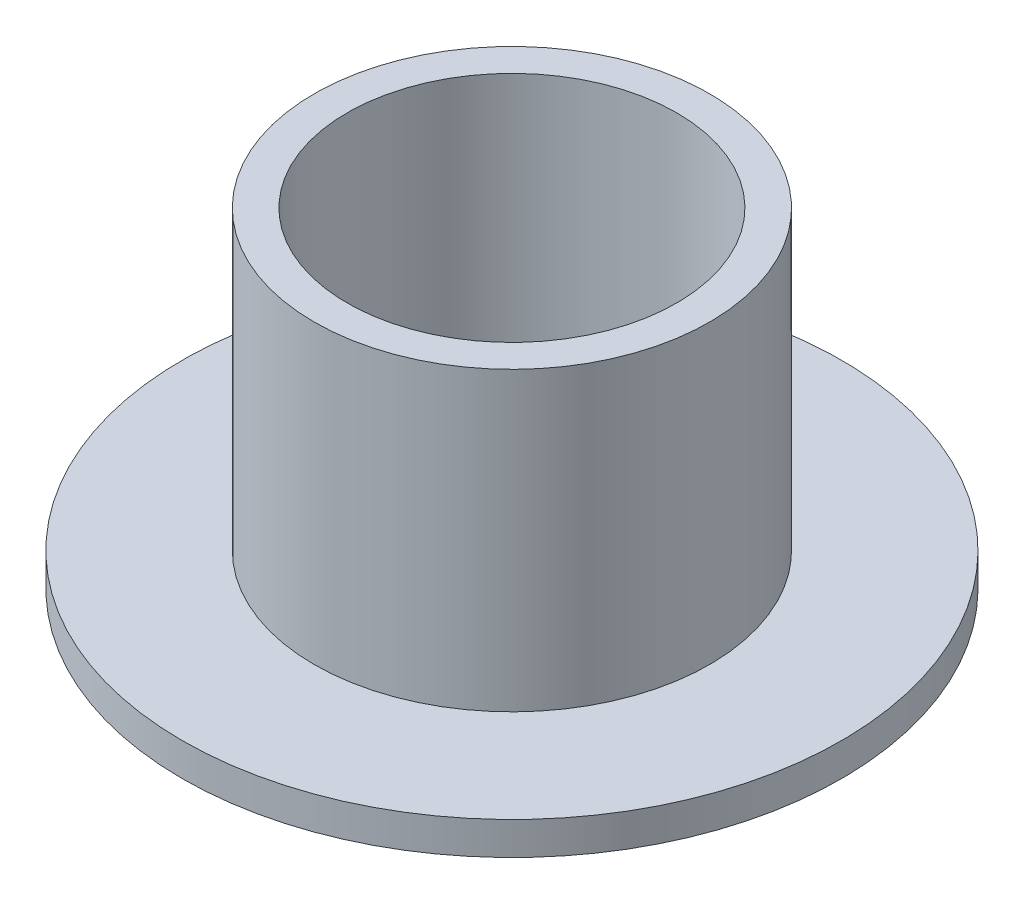
ISO-10303-21;
HEADER;
FILE_DESCRIPTION(('STEP AP214'),'2;1');
FILE_NAME('part.step','',(''),(''),'','','');
FILE_SCHEMA(('AUTOMOTIVE_DESIGN { 1 0 10303 214 1 1 1 1 }'));
ENDSEC;
DATA;
#1=APPLICATION_CONTEXT('core data for automotive mechanical design processes');
#2=APPLICATION_PROTOCOL_DEFINITION('international standard','automotive_design',2000,#1);
#3=PRODUCT_CONTEXT('',#1,'mechanical');
#4=PRODUCT('Part','Part','',(#3));
#5=PRODUCT_RELATED_PRODUCT_CATEGORY('part','',(#4));
#6=PRODUCT_DEFINITION_FORMATION('','',#4);
#7=PRODUCT_DEFINITION_CONTEXT('part definition',#1,'design');
#8=PRODUCT_DEFINITION('design','',#6,#7);
#9=PRODUCT_DEFINITION_SHAPE('','',#8);
#10=(LENGTH_UNIT() NAMED_UNIT(*) SI_UNIT(.MILLI.,.METRE.));
#11=(NAMED_UNIT(*) PLANE_ANGLE_UNIT() SI_UNIT($,.RADIAN.));
#12=(NAMED_UNIT(*) SI_UNIT($,.STERADIAN.) SOLID_ANGLE_UNIT());
#13=UNCERTAINTY_MEASURE_WITH_UNIT(LENGTH_MEASURE(1.E-05),#10,'distance_accuracy_value','');
#14=(GEOMETRIC_REPRESENTATION_CONTEXT(3) GLOBAL_UNCERTAINTY_ASSIGNED_CONTEXT((#13)) GLOBAL_UNIT_ASSIGNED_CONTEXT((#10,
#11,#12)) REPRESENTATION_CONTEXT('',''));
#15=CARTESIAN_POINT('',(0.,0.,0.));
#16=DIRECTION('',(0.,0.,1.));
#17=DIRECTION('',(1.,0.,0.));
#18=AXIS2_PLACEMENT_3D('',#15,#16,#17);
#19=CARTESIAN_POINT('',(0.,0.5,0.));
#20=DIRECTION('',(0.,-1.,0.));
#21=DIRECTION('',(0.,0.,-1.));
#22=AXIS2_PLACEMENT_3D('',#19,#20,#21);
#23=CYLINDRICAL_SURFACE('',#22,5.);
#24=CARTESIAN_POINT('',(0.,0.5,0.));
#25=DIRECTION('',(0.,1.,0.));
#26=DIRECTION('',(0.,0.,1.));
#27=AXIS2_PLACEMENT_3D('',#24,#25,#26);
#28=CIRCLE('',#27,5.);
#29=CARTESIAN_POINT('',(0.,0.5,5.));
#30=VERTEX_POINT('',#29);
#31=EDGE_CURVE('E49',#30,#30,#28,.T.);
#32=ORIENTED_EDGE('',*,*,#31,.F.);
#33=EDGE_LOOP('',(#32));
#34=FACE_BOUND('',#33,.T.);
#35=CARTESIAN_POINT('',(0.,0.,0.));
#36=DIRECTION('',(0.,1.,0.));
#37=DIRECTION('',(0.,0.,1.));
#38=AXIS2_PLACEMENT_3D('',#35,#36,#37);
#39=CIRCLE('',#38,5.);
#40=CARTESIAN_POINT('',(0.,0.,5.));
#41=VERTEX_POINT('',#40);
#42=EDGE_CURVE('E44',#41,#41,#39,.T.);
#43=ORIENTED_EDGE('',*,*,#42,.T.);
#44=EDGE_LOOP('',(#43));
#45=FACE_BOUND('',#44,.T.);
#46=ADVANCED_FACE('F41',(#34,#45),#23,.T.);
#47=CARTESIAN_POINT('',(0.,0.5,0.));
#48=DIRECTION('',(0.,1.,0.));
#49=DIRECTION('',(0.,0.,1.));
#50=AXIS2_PLACEMENT_3D('',#47,#48,#49);
#51=PLANE('',#50);
#52=CARTESIAN_POINT('',(0.,0.5,0.));
#53=DIRECTION('',(0.,1.,0.));
#54=DIRECTION('',(0.,0.,1.));
#55=AXIS2_PLACEMENT_3D('',#52,#53,#54);
#56=CIRCLE('',#55,3.);
#57=CARTESIAN_POINT('',(0.,0.5,3.));
#58=VERTEX_POINT('',#57);
#59=EDGE_CURVE('E10',#58,#58,#56,.T.);
#60=ORIENTED_EDGE('',*,*,#59,.F.);
#61=EDGE_LOOP('',(#60));
#62=FACE_BOUND('',#61,.T.);
#63=ORIENTED_EDGE('',*,*,#31,.T.);
#64=EDGE_LOOP('',(#63));
#65=FACE_BOUND('',#64,.T.);
#66=ADVANCED_FACE('F82',(#62,#65),#51,.T.);
#67=CARTESIAN_POINT('',(0.,0.,0.));
#68=DIRECTION('',(0.,1.,0.));
#69=DIRECTION('',(0.,0.,1.));
#70=AXIS2_PLACEMENT_3D('',#67,#68,#69);
#71=PLANE('',#70);
#72=CARTESIAN_POINT('',(0.,0.,0.));
#73=DIRECTION('',(0.,-1.,0.));
#74=DIRECTION('',(0.,0.,-1.));
#75=AXIS2_PLACEMENT_3D('',#72,#73,#74);
#76=CIRCLE('',#75,2.5);
#77=CARTESIAN_POINT('',(0.,0.,-2.5));
#78=VERTEX_POINT('',#77);
#79=EDGE_CURVE('E61',#78,#78,#76,.T.);
#80=ORIENTED_EDGE('',*,*,#79,.F.);
#81=EDGE_LOOP('',(#80));
#82=FACE_BOUND('',#81,.T.);
#83=ORIENTED_EDGE('',*,*,#42,.F.);
#84=EDGE_LOOP('',(#83));
#85=FACE_BOUND('',#84,.T.);
#86=ADVANCED_FACE('F78',(#82,#85),#71,.F.);
#87=CARTESIAN_POINT('',(0.,5.,0.));
#88=DIRECTION('',(0.,-1.,0.));
#89=DIRECTION('',(0.,0.,-1.));
#90=AXIS2_PLACEMENT_3D('',#87,#88,#89);
#91=CYLINDRICAL_SURFACE('',#90,3.);
#92=CARTESIAN_POINT('',(0.,5.,0.));
#93=DIRECTION('',(0.,1.,0.));
#94=DIRECTION('',(0.,0.,1.));
#95=AXIS2_PLACEMENT_3D('',#92,#93,#94);
#96=CIRCLE('',#95,3.);
#97=CARTESIAN_POINT('',(0.,5.,3.));
#98=VERTEX_POINT('',#97);
#99=EDGE_CURVE('E56',#98,#98,#96,.T.);
#100=ORIENTED_EDGE('',*,*,#99,.F.);
#101=EDGE_LOOP('',(#100));
#102=FACE_BOUND('',#101,.T.);
#103=ORIENTED_EDGE('',*,*,#59,.T.);
#104=EDGE_LOOP('',(#103));
#105=FACE_BOUND('',#104,.T.);
#106=ADVANCED_FACE('F81',(#102,#105),#91,.T.);
#107=CARTESIAN_POINT('',(0.,5.,0.));
#108=DIRECTION('',(0.,1.,0.));
#109=DIRECTION('',(0.,0.,1.));
#110=AXIS2_PLACEMENT_3D('',#107,#108,#109);
#111=PLANE('',#110);
#112=CARTESIAN_POINT('',(0.,5.,0.));
#113=DIRECTION('',(0.,-1.,0.));
#114=DIRECTION('',(0.,0.,-1.));
#115=AXIS2_PLACEMENT_3D('',#112,#113,#114);
#116=CIRCLE('',#115,2.5);
#117=CARTESIAN_POINT('',(0.,5.,-2.5));
#118=VERTEX_POINT('',#117);
#119=EDGE_CURVE('E60',#118,#118,#116,.T.);
#120=ORIENTED_EDGE('',*,*,#119,.T.);
#121=EDGE_LOOP('',(#120));
#122=FACE_BOUND('',#121,.T.);
#123=ORIENTED_EDGE('',*,*,#99,.T.);
#124=EDGE_LOOP('',(#123));
#125=FACE_BOUND('',#124,.T.);
#126=ADVANCED_FACE('F69',(#122,#125),#111,.T.);
#127=CARTESIAN_POINT('',(0.,5.,0.));
#128=DIRECTION('',(0.,-1.,0.));
#129=DIRECTION('',(0.,0.,-1.));
#130=AXIS2_PLACEMENT_3D('',#127,#128,#129);
#131=CYLINDRICAL_SURFACE('',#130,2.5);
#132=ORIENTED_EDGE('',*,*,#119,.F.);
#133=EDGE_LOOP('',(#132));
#134=FACE_BOUND('',#133,.T.);
#135=ORIENTED_EDGE('',*,*,#79,.T.);
#136=EDGE_LOOP('',(#135));
#137=FACE_BOUND('',#136,.T.);
#138=ADVANCED_FACE('F72',(#134,#137),#131,.F.);
#139=CLOSED_SHELL('',(#46,#66,#86,#106,#126,#138));
#140=MANIFOLD_SOLID_BREP('B2',#139);
#141=ADVANCED_BREP_SHAPE_REPRESENTATION('',(#18,#140),#14);
#142=SHAPE_DEFINITION_REPRESENTATION(#9,#141);
ENDSEC;
END-ISO-10303-21;
